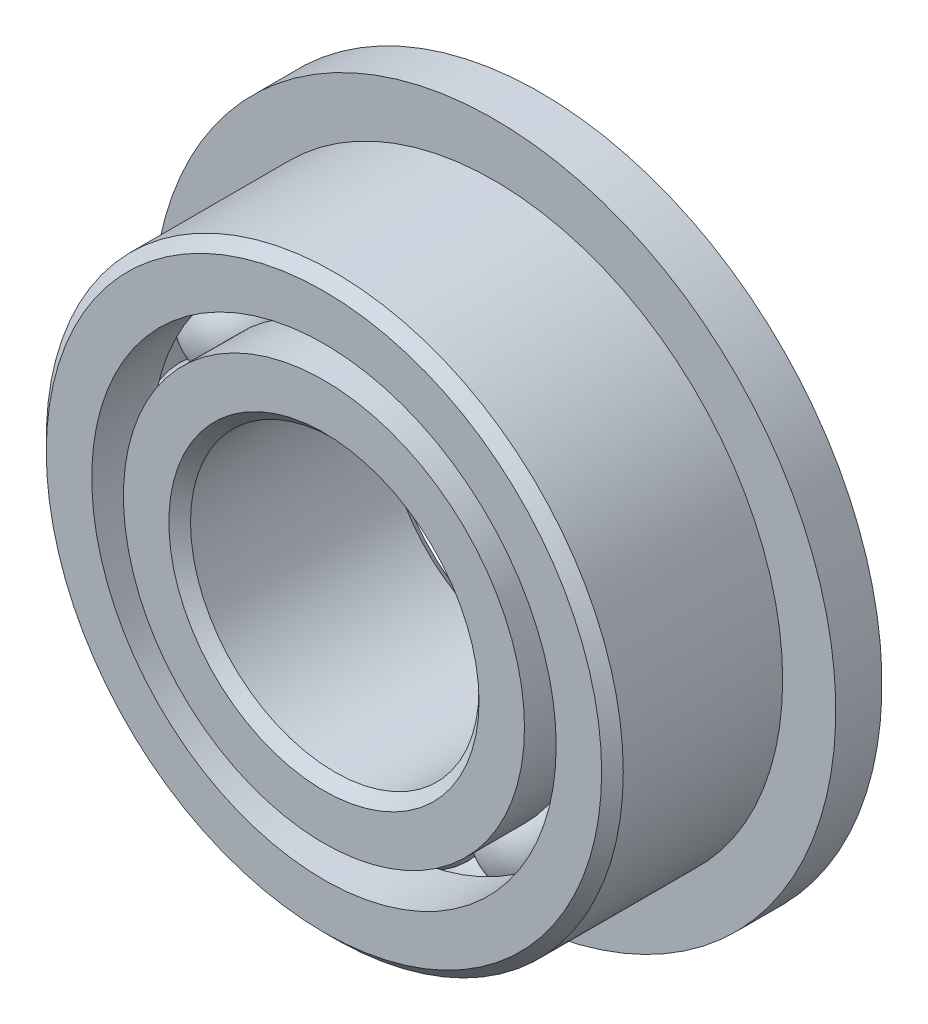
ISO-10303-21;
HEADER;
FILE_DESCRIPTION(('STEP AP214'),'2;1');
FILE_NAME('part.step','',(''),(''),'','','');
FILE_SCHEMA(('AUTOMOTIVE_DESIGN { 1 0 10303 214 1 1 1 1 }'));
ENDSEC;
DATA;
#1=APPLICATION_CONTEXT('core data for automotive mechanical design processes');
#2=APPLICATION_PROTOCOL_DEFINITION('international standard','automotive_design',2000,#1);
#3=PRODUCT_CONTEXT('',#1,'mechanical');
#4=PRODUCT('Part','Part','',(#3));
#5=PRODUCT_RELATED_PRODUCT_CATEGORY('part','',(#4));
#6=PRODUCT_DEFINITION_FORMATION('','',#4);
#7=PRODUCT_DEFINITION_CONTEXT('part definition',#1,'design');
#8=PRODUCT_DEFINITION('design','',#6,#7);
#9=PRODUCT_DEFINITION_SHAPE('','',#8);
#10=(LENGTH_UNIT() NAMED_UNIT(*) SI_UNIT(.MILLI.,.METRE.));
#11=(NAMED_UNIT(*) PLANE_ANGLE_UNIT() SI_UNIT($,.RADIAN.));
#12=(NAMED_UNIT(*) SI_UNIT($,.STERADIAN.) SOLID_ANGLE_UNIT());
#13=UNCERTAINTY_MEASURE_WITH_UNIT(LENGTH_MEASURE(1.E-05),#10,'distance_accuracy_value','');
#14=(GEOMETRIC_REPRESENTATION_CONTEXT(3) GLOBAL_UNCERTAINTY_ASSIGNED_CONTEXT((#13)) GLOBAL_UNIT_ASSIGNED_CONTEXT((#10,
#11,#12)) REPRESENTATION_CONTEXT('',''));
#15=CARTESIAN_POINT('',(0.,0.,0.));
#16=DIRECTION('',(0.,0.,1.));
#17=DIRECTION('',(1.,0.,0.));
#18=AXIS2_PLACEMENT_3D('',#15,#16,#17);
#19=CARTESIAN_POINT('',(-1.19062499999997,2.06222299276171,0.));
#20=DIRECTION('',(0.,0.,1.));
#21=DIRECTION('',(0.499999999999989,-0.866025403784445,0.));
#22=AXIS2_PLACEMENT_3D('',#19,#20,#21);
#23=SPHERICAL_SURFACE('',#22,0.557180720515983);
#24=CARTESIAN_POINT('',(-1.19062499999997,2.06222299276171,0.557180720515982));
#25=VERTEX_POINT('',#24);
#26=VERTEX_LOOP('',#25);
#27=FACE_BOUND('',#26,.T.);
#28=ADVANCED_FACE('F42',(#27),#23,.T.);
#29=CLOSED_SHELL('',(#28));
#30=MANIFOLD_SOLID_BREP('B2',#29);
#31=CARTESIAN_POINT('',(-2.06222299276168,1.19062500000002,0.));
#32=DIRECTION('',(0.,0.,1.));
#33=DIRECTION('',(0.866025403784433,-0.50000000000001,0.));
#34=AXIS2_PLACEMENT_3D('',#31,#32,#33);
#35=SPHERICAL_SURFACE('',#34,0.557180720515983);
#36=CARTESIAN_POINT('',(-2.06222299276168,1.19062500000002,0.557180720515982));
#37=VERTEX_POINT('',#36);
#38=VERTEX_LOOP('',#37);
#39=FACE_BOUND('',#38,.T.);
#40=ADVANCED_FACE('F65',(#39),#35,.T.);
#41=CLOSED_SHELL('',(#40));
#42=MANIFOLD_SOLID_BREP('B6',#41);
#43=CARTESIAN_POINT('',(-2.38125,0.,0.));
#44=DIRECTION('',(0.,0.,1.));
#45=DIRECTION('',(1.,0.,0.));
#46=AXIS2_PLACEMENT_3D('',#43,#44,#45);
#47=SPHERICAL_SURFACE('',#46,0.557180720515983);
#48=CARTESIAN_POINT('',(-2.38125,0.,0.557180720515982));
#49=VERTEX_POINT('',#48);
#50=VERTEX_LOOP('',#49);
#51=FACE_BOUND('',#50,.T.);
#52=ADVANCED_FACE('F88',(#51),#47,.T.);
#53=CLOSED_SHELL('',(#52));
#54=MANIFOLD_SOLID_BREP('B38',#53);
#55=CARTESIAN_POINT('',(-2.06222299276171,-1.19062499999998,0.));
#56=DIRECTION('',(0.,0.,1.));
#57=DIRECTION('',(0.866025403784443,0.499999999999992,0.));
#58=AXIS2_PLACEMENT_3D('',#55,#56,#57);
#59=SPHERICAL_SURFACE('',#58,0.557180720515983);
#60=CARTESIAN_POINT('',(-2.06222299276171,-1.19062499999998,0.557180720515982));
#61=VERTEX_POINT('',#60);
#62=VERTEX_LOOP('',#61);
#63=FACE_BOUND('',#62,.T.);
#64=ADVANCED_FACE('F111',(#63),#59,.T.);
#65=CLOSED_SHELL('',(#64));
#66=MANIFOLD_SOLID_BREP('B61',#65);
#67=CARTESIAN_POINT('',(-1.19062500000002,-2.06222299276169,0.));
#68=DIRECTION('',(0.,0.,1.));
#69=DIRECTION('',(0.500000000000007,0.866025403784435,0.));
#70=AXIS2_PLACEMENT_3D('',#67,#68,#69);
#71=SPHERICAL_SURFACE('',#70,0.557180720515983);
#72=CARTESIAN_POINT('',(-1.19062500000002,-2.06222299276169,0.557180720515982));
#73=VERTEX_POINT('',#72);
#74=VERTEX_LOOP('',#73);
#75=FACE_BOUND('',#74,.T.);
#76=ADVANCED_FACE('F134',(#75),#71,.T.);
#77=CLOSED_SHELL('',(#76));
#78=MANIFOLD_SOLID_BREP('B84',#77);
#79=CARTESIAN_POINT('',(0.,-2.38125,0.));
#80=DIRECTION('',(0.,0.,1.));
#81=DIRECTION('',(0.,1.,0.));
#82=AXIS2_PLACEMENT_3D('',#79,#80,#81);
#83=SPHERICAL_SURFACE('',#82,0.557180720515983);
#84=CARTESIAN_POINT('',(0.,-2.38125,0.557180720515982));
#85=VERTEX_POINT('',#84);
#86=VERTEX_LOOP('',#85);
#87=FACE_BOUND('',#86,.T.);
#88=ADVANCED_FACE('F157',(#87),#83,.T.);
#89=CLOSED_SHELL('',(#88));
#90=MANIFOLD_SOLID_BREP('B107',#89);
#91=CARTESIAN_POINT('',(1.19062499999999,-2.0622229927617,0.));
#92=DIRECTION('',(0.,0.,1.));
#93=DIRECTION('',(-0.499999999999995,0.866025403784442,0.));
#94=AXIS2_PLACEMENT_3D('',#91,#92,#93);
#95=SPHERICAL_SURFACE('',#94,0.557180720515983);
#96=CARTESIAN_POINT('',(1.19062499999999,-2.0622229927617,0.557180720515982));
#97=VERTEX_POINT('',#96);
#98=VERTEX_LOOP('',#97);
#99=FACE_BOUND('',#98,.T.);
#100=ADVANCED_FACE('F180',(#99),#95,.T.);
#101=CLOSED_SHELL('',(#100));
#102=MANIFOLD_SOLID_BREP('B130',#101);
#103=CARTESIAN_POINT('',(2.06222299276169,-1.19062500000001,0.));
#104=DIRECTION('',(0.,0.,1.));
#105=DIRECTION('',(-0.866025403784436,0.500000000000004,0.));
#106=AXIS2_PLACEMENT_3D('',#103,#104,#105);
#107=SPHERICAL_SURFACE('',#106,0.557180720515983);
#108=CARTESIAN_POINT('',(2.06222299276169,-1.19062500000001,0.557180720515982));
#109=VERTEX_POINT('',#108);
#110=VERTEX_LOOP('',#109);
#111=FACE_BOUND('',#110,.T.);
#112=ADVANCED_FACE('F203',(#111),#107,.T.);
#113=CLOSED_SHELL('',(#112));
#114=MANIFOLD_SOLID_BREP('B153',#113);
#115=CARTESIAN_POINT('',(2.38125,0.,0.));
#116=DIRECTION('',(0.,0.,1.));
#117=DIRECTION('',(-1.,0.,0.));
#118=AXIS2_PLACEMENT_3D('',#115,#116,#117);
#119=SPHERICAL_SURFACE('',#118,0.557180720515983);
#120=CARTESIAN_POINT('',(2.38125,0.,0.557180720515982));
#121=VERTEX_POINT('',#120);
#122=VERTEX_LOOP('',#121);
#123=FACE_BOUND('',#122,.T.);
#124=ADVANCED_FACE('F226',(#123),#119,.T.);
#125=CLOSED_SHELL('',(#124));
#126=MANIFOLD_SOLID_BREP('B176',#125);
#127=CARTESIAN_POINT('',(2.0622229927617,1.190625,0.));
#128=DIRECTION('',(0.,0.,1.));
#129=DIRECTION('',(-0.86602540378444,-0.499999999999998,0.));
#130=AXIS2_PLACEMENT_3D('',#127,#128,#129);
#131=SPHERICAL_SURFACE('',#130,0.557180720515983);
#132=CARTESIAN_POINT('',(2.0622229927617,1.190625,0.557180720515982));
#133=VERTEX_POINT('',#132);
#134=VERTEX_LOOP('',#133);
#135=FACE_BOUND('',#134,.T.);
#136=ADVANCED_FACE('F249',(#135),#131,.T.);
#137=CLOSED_SHELL('',(#136));
#138=MANIFOLD_SOLID_BREP('B199',#137);
#139=CARTESIAN_POINT('',(1.190625,2.06222299276169,0.));
#140=DIRECTION('',(0.,0.,1.));
#141=DIRECTION('',(-0.500000000000001,-0.866025403784438,0.));
#142=AXIS2_PLACEMENT_3D('',#139,#140,#141);
#143=SPHERICAL_SURFACE('',#142,0.557180720515983);
#144=CARTESIAN_POINT('',(1.190625,2.06222299276169,0.557180720515982));
#145=VERTEX_POINT('',#144);
#146=VERTEX_LOOP('',#145);
#147=FACE_BOUND('',#146,.T.);
#148=ADVANCED_FACE('F272',(#147),#143,.T.);
#149=CLOSED_SHELL('',(#148));
#150=MANIFOLD_SOLID_BREP('B222',#149);
#151=CARTESIAN_POINT('',(0.,2.38125,0.));
#152=DIRECTION('',(0.,0.,1.));
#153=DIRECTION('',(0.,-1.,0.));
#154=AXIS2_PLACEMENT_3D('',#151,#152,#153);
#155=SPHERICAL_SURFACE('',#154,0.557180720515983);
#156=CARTESIAN_POINT('',(0.,2.38125,0.557180720515982));
#157=VERTEX_POINT('',#156);
#158=VERTEX_LOOP('',#157);
#159=FACE_BOUND('',#158,.T.);
#160=ADVANCED_FACE('F297',(#159),#155,.T.);
#161=CLOSED_SHELL('',(#160));
#162=MANIFOLD_SOLID_BREP('B245',#161);
#163=CARTESIAN_POINT('',(0.,2.20679945054945,1.190625));
#164=DIRECTION('',(0.,0.,-1.));
#165=DIRECTION('',(-1.,0.,0.));
#166=AXIS2_PLACEMENT_3D('',#163,#164,#165);
#167=PLANE('',#166);
#168=CARTESIAN_POINT('',(0.,0.,1.190625));
#169=DIRECTION('',(0.,0.,1.));
#170=DIRECTION('',(1.,0.,0.));
#171=AXIS2_PLACEMENT_3D('',#168,#169,#170);
#172=CIRCLE('',#171,1.7065625);
#173=CARTESIAN_POINT('',(1.7065625,0.,1.190625));
#174=VERTEX_POINT('',#173);
#175=EDGE_CURVE('E347',#174,#174,#172,.T.);
#176=ORIENTED_EDGE('',*,*,#175,.F.);
#177=EDGE_LOOP('',(#176));
#178=FACE_BOUND('',#177,.T.);
#179=CARTESIAN_POINT('',(0.,0.,1.190625));
#180=DIRECTION('',(0.,0.,1.));
#181=DIRECTION('',(1.,0.,0.));
#182=AXIS2_PLACEMENT_3D('',#179,#180,#181);
#183=CIRCLE('',#182,2.20679945054945);
#184=CARTESIAN_POINT('',(2.20679945054945,0.,1.190625));
#185=VERTEX_POINT('',#184);
#186=EDGE_CURVE('E296',#185,#185,#183,.T.);
#187=ORIENTED_EDGE('',*,*,#186,.T.);
#188=EDGE_LOOP('',(#187));
#189=FACE_BOUND('',#188,.T.);
#190=ADVANCED_FACE('F319',(#178,#189),#167,.F.);
#191=CARTESIAN_POINT('',(0.,0.,1.190625));
#192=DIRECTION('',(0.,0.,1.));
#193=DIRECTION('',(1.,0.,0.));
#194=AXIS2_PLACEMENT_3D('',#191,#192,#193);
#195=CYLINDRICAL_SURFACE('',#194,2.20679945054945);
#196=ORIENTED_EDGE('',*,*,#186,.F.);
#197=EDGE_LOOP('',(#196));
#198=FACE_BOUND('',#197,.T.);
#199=CARTESIAN_POINT('',(0.,0.,0.529166666666666));
#200=DIRECTION('',(0.,0.,1.));
#201=DIRECTION('',(1.,0.,0.));
#202=AXIS2_PLACEMENT_3D('',#199,#200,#201);
#203=CIRCLE('',#202,2.20679945054945);
#204=CARTESIAN_POINT('',(2.20679945054945,0.,0.529166666666666));
#205=VERTEX_POINT('',#204);
#206=EDGE_CURVE('E325',#205,#205,#203,.T.);
#207=ORIENTED_EDGE('',*,*,#206,.T.);
#208=EDGE_LOOP('',(#207));
#209=FACE_BOUND('',#208,.T.);
#210=ADVANCED_FACE('F354',(#198,#209),#195,.T.);
#211=CARTESIAN_POINT('',(0.,0.,0.));
#212=DIRECTION('',(0.,0.,1.));
#213=DIRECTION('',(1.,0.,0.));
#214=AXIS2_PLACEMENT_3D('',#211,#212,#213);
#215=TOROIDAL_SURFACE('',#214,2.38125,0.557180720515983);
#216=ORIENTED_EDGE('',*,*,#206,.F.);
#217=EDGE_LOOP('',(#216));
#218=FACE_BOUND('',#217,.T.);
#219=CARTESIAN_POINT('',(0.,0.,-0.529166666666668));
#220=DIRECTION('',(0.,0.,1.));
#221=DIRECTION('',(1.,0.,0.));
#222=AXIS2_PLACEMENT_3D('',#219,#220,#221);
#223=CIRCLE('',#222,2.20679945054945);
#224=CARTESIAN_POINT('',(2.20679945054945,0.,-0.529166666666668));
#225=VERTEX_POINT('',#224);
#226=EDGE_CURVE('E329',#225,#225,#223,.T.);
#227=ORIENTED_EDGE('',*,*,#226,.T.);
#228=EDGE_LOOP('',(#227));
#229=FACE_BOUND('',#228,.T.);
#230=ADVANCED_FACE('F358',(#218,#229),#215,.F.);
#231=CARTESIAN_POINT('',(0.,0.,1.190625));
#232=DIRECTION('',(0.,0.,1.));
#233=DIRECTION('',(1.,0.,0.));
#234=AXIS2_PLACEMENT_3D('',#231,#232,#233);
#235=CYLINDRICAL_SURFACE('',#234,2.20679945054945);
#236=ORIENTED_EDGE('',*,*,#226,.F.);
#237=EDGE_LOOP('',(#236));
#238=FACE_BOUND('',#237,.T.);
#239=CARTESIAN_POINT('',(0.,0.,-1.190625));
#240=DIRECTION('',(0.,0.,1.));
#241=DIRECTION('',(1.,0.,0.));
#242=AXIS2_PLACEMENT_3D('',#239,#240,#241);
#243=CIRCLE('',#242,2.20679945054945);
#244=CARTESIAN_POINT('',(2.20679945054945,0.,-1.190625));
#245=VERTEX_POINT('',#244);
#246=EDGE_CURVE('E333',#245,#245,#243,.T.);
#247=ORIENTED_EDGE('',*,*,#246,.T.);
#248=EDGE_LOOP('',(#247));
#249=FACE_BOUND('',#248,.T.);
#250=ADVANCED_FACE('F363',(#238,#249),#235,.T.);
#251=CARTESIAN_POINT('',(0.,1.7065625,-1.190625));
#252=DIRECTION('',(0.,0.,1.));
#253=DIRECTION('',(1.,0.,0.));
#254=AXIS2_PLACEMENT_3D('',#251,#252,#253);
#255=PLANE('',#254);
#256=ORIENTED_EDGE('',*,*,#246,.F.);
#257=EDGE_LOOP('',(#256));
#258=FACE_BOUND('',#257,.T.);
#259=CARTESIAN_POINT('',(0.,0.,-1.190625));
#260=DIRECTION('',(0.,0.,1.));
#261=DIRECTION('',(1.,0.,0.));
#262=AXIS2_PLACEMENT_3D('',#259,#260,#261);
#263=CIRCLE('',#262,1.7065625);
#264=CARTESIAN_POINT('',(1.7065625,0.,-1.190625));
#265=VERTEX_POINT('',#264);
#266=EDGE_CURVE('E338',#265,#265,#263,.T.);
#267=ORIENTED_EDGE('',*,*,#266,.T.);
#268=EDGE_LOOP('',(#267));
#269=FACE_BOUND('',#268,.T.);
#270=ADVANCED_FACE('F369',(#258,#269),#255,.F.);
#271=CARTESIAN_POINT('',(0.,0.,-1.0715625));
#272=DIRECTION('',(0.,0.,-1.));
#273=DIRECTION('',(-1.,0.,0.));
#274=AXIS2_PLACEMENT_3D('',#271,#272,#273);
#275=CONICAL_SURFACE('',#274,1.5875,0.78539816339744);
#276=ORIENTED_EDGE('',*,*,#266,.F.);
#277=EDGE_LOOP('',(#276));
#278=FACE_BOUND('',#277,.T.);
#279=CARTESIAN_POINT('',(0.,0.,-1.0715625));
#280=DIRECTION('',(0.,0.,1.));
#281=DIRECTION('',(1.,0.,0.));
#282=AXIS2_PLACEMENT_3D('',#279,#280,#281);
#283=CIRCLE('',#282,1.5875);
#284=CARTESIAN_POINT('',(1.5875,0.,-1.0715625));
#285=VERTEX_POINT('',#284);
#286=EDGE_CURVE('E341',#285,#285,#283,.T.);
#287=ORIENTED_EDGE('',*,*,#286,.T.);
#288=EDGE_LOOP('',(#287));
#289=FACE_BOUND('',#288,.T.);
#290=ADVANCED_FACE('F373',(#278,#289),#275,.F.);
#291=CARTESIAN_POINT('',(0.,0.,1.190625));
#292=DIRECTION('',(0.,0.,1.));
#293=DIRECTION('',(1.,0.,0.));
#294=AXIS2_PLACEMENT_3D('',#291,#292,#293);
#295=CYLINDRICAL_SURFACE('',#294,1.5875);
#296=ORIENTED_EDGE('',*,*,#286,.F.);
#297=EDGE_LOOP('',(#296));
#298=FACE_BOUND('',#297,.T.);
#299=CARTESIAN_POINT('',(0.,0.,1.0715625));
#300=DIRECTION('',(0.,0.,1.));
#301=DIRECTION('',(1.,0.,0.));
#302=AXIS2_PLACEMENT_3D('',#299,#300,#301);
#303=CIRCLE('',#302,1.5875);
#304=CARTESIAN_POINT('',(1.5875,0.,1.0715625));
#305=VERTEX_POINT('',#304);
#306=EDGE_CURVE('E344',#305,#305,#303,.T.);
#307=ORIENTED_EDGE('',*,*,#306,.T.);
#308=EDGE_LOOP('',(#307));
#309=FACE_BOUND('',#308,.T.);
#310=ADVANCED_FACE('F377',(#298,#309),#295,.F.);
#311=CARTESIAN_POINT('',(0.,0.,1.190625));
#312=DIRECTION('',(0.,0.,1.));
#313=DIRECTION('',(1.,0.,0.));
#314=AXIS2_PLACEMENT_3D('',#311,#312,#313);
#315=CONICAL_SURFACE('',#314,1.7065625,0.785398163397456);
#316=ORIENTED_EDGE('',*,*,#306,.F.);
#317=EDGE_LOOP('',(#316));
#318=FACE_BOUND('',#317,.T.);
#319=ORIENTED_EDGE('',*,*,#175,.T.);
#320=EDGE_LOOP('',(#319));
#321=FACE_BOUND('',#320,.T.);
#322=ADVANCED_FACE('F351',(#318,#321),#315,.F.);
#323=CLOSED_SHELL('',(#190,#210,#230,#250,#270,#290,#310,#322));
#324=MANIFOLD_SOLID_BREP('B268',#323);
#325=CARTESIAN_POINT('',(0.,0.,1.0715625));
#326=DIRECTION('',(0.,0.,-1.));
#327=DIRECTION('',(-1.,0.,0.));
#328=AXIS2_PLACEMENT_3D('',#325,#326,#327);
#329=CONICAL_SURFACE('',#328,3.175,0.785398163397445);
#330=CARTESIAN_POINT('',(0.,0.,1.190625));
#331=DIRECTION('',(0.,0.,1.));
#332=DIRECTION('',(1.,0.,0.));
#333=AXIS2_PLACEMENT_3D('',#330,#331,#332);
#334=CIRCLE('',#333,3.0559375);
#335=CARTESIAN_POINT('',(3.0559375,0.,1.190625));
#336=VERTEX_POINT('',#335);
#337=EDGE_CURVE('E465',#336,#336,#334,.T.);
#338=ORIENTED_EDGE('',*,*,#337,.F.);
#339=EDGE_LOOP('',(#338));
#340=FACE_BOUND('',#339,.T.);
#341=CARTESIAN_POINT('',(0.,0.,1.0715625));
#342=DIRECTION('',(0.,0.,1.));
#343=DIRECTION('',(1.,0.,0.));
#344=AXIS2_PLACEMENT_3D('',#341,#342,#343);
#345=CIRCLE('',#344,3.175);
#346=CARTESIAN_POINT('',(3.175,0.,1.0715625));
#347=VERTEX_POINT('',#346);
#348=EDGE_CURVE('E318',#347,#347,#345,.T.);
#349=ORIENTED_EDGE('',*,*,#348,.T.);
#350=EDGE_LOOP('',(#349));
#351=FACE_BOUND('',#350,.T.);
#352=ADVANCED_FACE('F443',(#340,#351),#329,.T.);
#353=CARTESIAN_POINT('',(0.,0.,1.190625));
#354=DIRECTION('',(0.,0.,1.));
#355=DIRECTION('',(1.,0.,0.));
#356=AXIS2_PLACEMENT_3D('',#353,#354,#355);
#357=CYLINDRICAL_SURFACE('',#356,3.175);
#358=CARTESIAN_POINT('',(0.,0.,-0.682625000000001));
#359=DIRECTION('',(0.,0.,1.));
#360=DIRECTION('',(1.,0.,0.));
#361=AXIS2_PLACEMENT_3D('',#358,#359,#360);
#362=CIRCLE('',#361,3.175);
#363=CARTESIAN_POINT('',(3.175,0.,-0.682625000000001));
#364=VERTEX_POINT('',#363);
#365=EDGE_CURVE('E446',#364,#364,#362,.T.);
#366=ORIENTED_EDGE('',*,*,#365,.T.);
#367=EDGE_LOOP('',(#366));
#368=FACE_BOUND('',#367,.T.);
#369=ORIENTED_EDGE('',*,*,#348,.F.);
#370=EDGE_LOOP('',(#369));
#371=FACE_BOUND('',#370,.T.);
#372=ADVANCED_FACE('F486',(#368,#371),#357,.T.);
#373=CARTESIAN_POINT('',(0.,3.0559375,-1.190625));
#374=DIRECTION('',(0.,0.,1.));
#375=DIRECTION('',(1.,0.,0.));
#376=AXIS2_PLACEMENT_3D('',#373,#374,#375);
#377=PLANE('',#376);
#378=CARTESIAN_POINT('',(0.,0.,-1.190625));
#379=DIRECTION('',(0.,0.,1.));
#380=DIRECTION('',(1.,0.,0.));
#381=AXIS2_PLACEMENT_3D('',#378,#379,#380);
#382=CIRCLE('',#381,2.55570054945055);
#383=CARTESIAN_POINT('',(2.55570054945055,0.,-1.190625));
#384=VERTEX_POINT('',#383);
#385=EDGE_CURVE('E450',#384,#384,#382,.T.);
#386=ORIENTED_EDGE('',*,*,#385,.T.);
#387=EDGE_LOOP('',(#386));
#388=FACE_BOUND('',#387,.T.);
#389=CARTESIAN_POINT('',(0.,0.,-1.190625));
#390=DIRECTION('',(0.,0.,-1.));
#391=DIRECTION('',(-1.,0.,0.));
#392=AXIS2_PLACEMENT_3D('',#389,#390,#391);
#393=CIRCLE('',#392,3.7592);
#394=CARTESIAN_POINT('',(-3.7592,0.,-1.190625));
#395=VERTEX_POINT('',#394);
#396=EDGE_CURVE('E468',#395,#395,#393,.T.);
#397=ORIENTED_EDGE('',*,*,#396,.T.);
#398=EDGE_LOOP('',(#397));
#399=FACE_BOUND('',#398,.T.);
#400=ADVANCED_FACE('F489',(#388,#399),#377,.F.);
#401=CARTESIAN_POINT('',(0.,0.,1.190625));
#402=DIRECTION('',(0.,0.,1.));
#403=DIRECTION('',(1.,0.,0.));
#404=AXIS2_PLACEMENT_3D('',#401,#402,#403);
#405=CYLINDRICAL_SURFACE('',#404,2.55570054945055);
#406=ORIENTED_EDGE('',*,*,#385,.F.);
#407=EDGE_LOOP('',(#406));
#408=FACE_BOUND('',#407,.T.);
#409=CARTESIAN_POINT('',(0.,0.,-0.529166666666667));
#410=DIRECTION('',(0.,0.,1.));
#411=DIRECTION('',(1.,0.,0.));
#412=AXIS2_PLACEMENT_3D('',#409,#410,#411);
#413=CIRCLE('',#412,2.55570054945055);
#414=CARTESIAN_POINT('',(2.55570054945055,0.,-0.529166666666667));
#415=VERTEX_POINT('',#414);
#416=EDGE_CURVE('E454',#415,#415,#413,.T.);
#417=ORIENTED_EDGE('',*,*,#416,.T.);
#418=EDGE_LOOP('',(#417));
#419=FACE_BOUND('',#418,.T.);
#420=ADVANCED_FACE('F494',(#408,#419),#405,.F.);
#421=CARTESIAN_POINT('',(0.,0.,0.));
#422=DIRECTION('',(0.,0.,1.));
#423=DIRECTION('',(1.,0.,0.));
#424=AXIS2_PLACEMENT_3D('',#421,#422,#423);
#425=TOROIDAL_SURFACE('',#424,2.38125,0.557180720515983);
#426=ORIENTED_EDGE('',*,*,#416,.F.);
#427=EDGE_LOOP('',(#426));
#428=FACE_BOUND('',#427,.T.);
#429=CARTESIAN_POINT('',(0.,0.,0.529166666666666));
#430=DIRECTION('',(0.,0.,1.));
#431=DIRECTION('',(1.,0.,0.));
#432=AXIS2_PLACEMENT_3D('',#429,#430,#431);
#433=CIRCLE('',#432,2.55570054945055);
#434=CARTESIAN_POINT('',(2.55570054945055,0.,0.529166666666666));
#435=VERTEX_POINT('',#434);
#436=EDGE_CURVE('E459',#435,#435,#433,.T.);
#437=ORIENTED_EDGE('',*,*,#436,.T.);
#438=EDGE_LOOP('',(#437));
#439=FACE_BOUND('',#438,.T.);
#440=ADVANCED_FACE('F501',(#428,#439),#425,.F.);
#441=CARTESIAN_POINT('',(0.,0.,1.190625));
#442=DIRECTION('',(0.,0.,1.));
#443=DIRECTION('',(1.,0.,0.));
#444=AXIS2_PLACEMENT_3D('',#441,#442,#443);
#445=CYLINDRICAL_SURFACE('',#444,2.55570054945055);
#446=ORIENTED_EDGE('',*,*,#436,.F.);
#447=EDGE_LOOP('',(#446));
#448=FACE_BOUND('',#447,.T.);
#449=CARTESIAN_POINT('',(0.,0.,1.190625));
#450=DIRECTION('',(0.,0.,1.));
#451=DIRECTION('',(1.,0.,0.));
#452=AXIS2_PLACEMENT_3D('',#449,#450,#451);
#453=CIRCLE('',#452,2.55570054945055);
#454=CARTESIAN_POINT('',(2.55570054945055,0.,1.190625));
#455=VERTEX_POINT('',#454);
#456=EDGE_CURVE('E462',#455,#455,#453,.T.);
#457=ORIENTED_EDGE('',*,*,#456,.T.);
#458=EDGE_LOOP('',(#457));
#459=FACE_BOUND('',#458,.T.);
#460=ADVANCED_FACE('F505',(#448,#459),#445,.F.);
#461=CARTESIAN_POINT('',(0.,3.0559375,1.190625));
#462=DIRECTION('',(0.,0.,-1.));
#463=DIRECTION('',(-1.,0.,0.));
#464=AXIS2_PLACEMENT_3D('',#461,#462,#463);
#465=PLANE('',#464);
#466=ORIENTED_EDGE('',*,*,#456,.F.);
#467=EDGE_LOOP('',(#466));
#468=FACE_BOUND('',#467,.T.);
#469=ORIENTED_EDGE('',*,*,#337,.T.);
#470=EDGE_LOOP('',(#469));
#471=FACE_BOUND('',#470,.T.);
#472=ADVANCED_FACE('F481',(#468,#471),#465,.F.);
#473=CARTESIAN_POINT('',(0.,2.80581902472527,-0.682625000000001));
#474=DIRECTION('',(0.,0.,1.));
#475=DIRECTION('',(1.,0.,0.));
#476=AXIS2_PLACEMENT_3D('',#473,#474,#475);
#477=PLANE('',#476);
#478=CARTESIAN_POINT('',(0.,0.,-0.682625000000001));
#479=DIRECTION('',(0.,0.,-1.));
#480=DIRECTION('',(-1.,0.,0.));
#481=AXIS2_PLACEMENT_3D('',#478,#479,#480);
#482=CIRCLE('',#481,3.7592);
#483=CARTESIAN_POINT('',(-3.7592,0.,-0.682625000000001));
#484=VERTEX_POINT('',#483);
#485=EDGE_CURVE('E471',#484,#484,#482,.T.);
#486=ORIENTED_EDGE('',*,*,#485,.F.);
#487=EDGE_LOOP('',(#486));
#488=FACE_BOUND('',#487,.T.);
#489=ORIENTED_EDGE('',*,*,#365,.F.);
#490=EDGE_LOOP('',(#489));
#491=FACE_BOUND('',#490,.T.);
#492=ADVANCED_FACE('F478',(#488,#491),#477,.T.);
#493=CARTESIAN_POINT('',(0.,0.,-1.190625));
#494=DIRECTION('',(0.,0.,-1.));
#495=DIRECTION('',(-1.,0.,0.));
#496=AXIS2_PLACEMENT_3D('',#493,#494,#495);
#497=CYLINDRICAL_SURFACE('',#496,3.7592);
#498=ORIENTED_EDGE('',*,*,#485,.T.);
#499=EDGE_LOOP('',(#498));
#500=FACE_BOUND('',#499,.T.);
#501=ORIENTED_EDGE('',*,*,#396,.F.);
#502=EDGE_LOOP('',(#501));
#503=FACE_BOUND('',#502,.T.);
#504=ADVANCED_FACE('F475',(#500,#503),#497,.T.);
#505=CLOSED_SHELL('',(#352,#372,#400,#420,#440,#460,#472,#492,#504));
#506=MANIFOLD_SOLID_BREP('B291',#505);
#507=ADVANCED_BREP_SHAPE_REPRESENTATION('',(#18,#30,#42,#54,#66,#78,#90,#102,#114,#126,#138,
#150,#162,#324,#506),#14);
#508=SHAPE_DEFINITION_REPRESENTATION(#9,#507);
ENDSEC;
END-ISO-10303-21;
